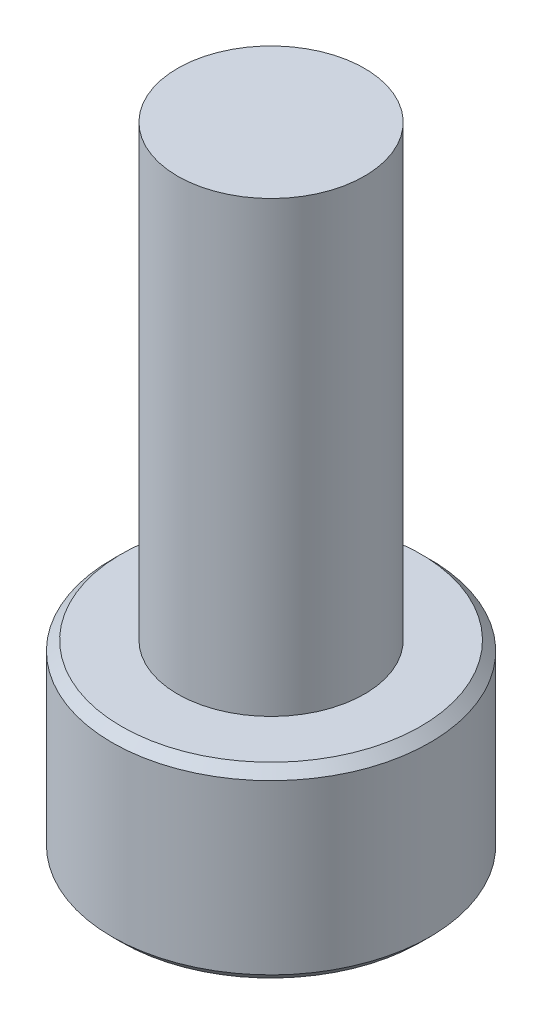
ISO-10303-21;
HEADER;
FILE_DESCRIPTION(('STEP AP214'),'2;1');
FILE_NAME('part.step','',(''),(''),'','','');
FILE_SCHEMA(('AUTOMOTIVE_DESIGN { 1 0 10303 214 1 1 1 1 }'));
ENDSEC;
DATA;
#1=APPLICATION_CONTEXT('core data for automotive mechanical design processes');
#2=APPLICATION_PROTOCOL_DEFINITION('international standard','automotive_design',2000,#1);
#3=PRODUCT_CONTEXT('',#1,'mechanical');
#4=PRODUCT('Part','Part','',(#3));
#5=PRODUCT_RELATED_PRODUCT_CATEGORY('part','',(#4));
#6=PRODUCT_DEFINITION_FORMATION('','',#4);
#7=PRODUCT_DEFINITION_CONTEXT('part definition',#1,'design');
#8=PRODUCT_DEFINITION('design','',#6,#7);
#9=PRODUCT_DEFINITION_SHAPE('','',#8);
#10=(LENGTH_UNIT() NAMED_UNIT(*) SI_UNIT(.MILLI.,.METRE.));
#11=(NAMED_UNIT(*) PLANE_ANGLE_UNIT() SI_UNIT($,.RADIAN.));
#12=(NAMED_UNIT(*) SI_UNIT($,.STERADIAN.) SOLID_ANGLE_UNIT());
#13=UNCERTAINTY_MEASURE_WITH_UNIT(LENGTH_MEASURE(1.E-05),#10,'distance_accuracy_value','');
#14=(GEOMETRIC_REPRESENTATION_CONTEXT(3) GLOBAL_UNCERTAINTY_ASSIGNED_CONTEXT((#13)) GLOBAL_UNIT_ASSIGNED_CONTEXT((#10,
#11,#12)) REPRESENTATION_CONTEXT('',''));
#15=CARTESIAN_POINT('',(0.,0.,0.));
#16=DIRECTION('',(0.,0.,1.));
#17=DIRECTION('',(1.,0.,0.));
#18=AXIS2_PLACEMENT_3D('',#15,#16,#17);
#19=CARTESIAN_POINT('',(0.,-5.,0.));
#20=DIRECTION('',(0.,1.,0.));
#21=DIRECTION('',(0.,0.,1.));
#22=AXIS2_PLACEMENT_3D('',#19,#20,#21);
#23=PLANE('',#22);
#24=CARTESIAN_POINT('',(0.,-5.,0.));
#25=DIRECTION('',(0.,1.,0.));
#26=DIRECTION('',(0.,0.,1.));
#27=AXIS2_PLACEMENT_3D('',#24,#25,#26);
#28=CIRCLE('',#27,4.);
#29=CARTESIAN_POINT('',(0.,-5.,4.));
#30=VERTEX_POINT('',#29);
#31=EDGE_CURVE('E11',#30,#30,#28,.F.);
#32=ORIENTED_EDGE('',*,*,#31,.T.);
#33=EDGE_LOOP('',(#32));
#34=FACE_BOUND('',#33,.T.);
#35=DIRECTION('',(0.866025403784439,0.,-0.5));
#36=VECTOR('',#35,1.);
#37=CARTESIAN_POINT('',(1.,-5.,1.73205080756888));
#38=LINE('',#37,#36);
#39=CARTESIAN_POINT('',(0.,-5.,2.3094010767585));
#40=VERTEX_POINT('',#39);
#41=CARTESIAN_POINT('',(2.,-5.,1.15470053837925));
#42=VERTEX_POINT('',#41);
#43=EDGE_CURVE('E55',#40,#42,#38,.T.);
#44=ORIENTED_EDGE('',*,*,#43,.T.);
#45=DIRECTION('',(0.,0.,-1.));
#46=VECTOR('',#45,1.);
#47=CARTESIAN_POINT('',(2.,-5.,0.));
#48=LINE('',#47,#46);
#49=CARTESIAN_POINT('',(2.,-5.,-1.15470053837925));
#50=VERTEX_POINT('',#49);
#51=EDGE_CURVE('E126',#42,#50,#48,.T.);
#52=ORIENTED_EDGE('',*,*,#51,.T.);
#53=DIRECTION('',(-0.866025403784439,0.,-0.5));
#54=VECTOR('',#53,1.);
#55=CARTESIAN_POINT('',(1.,-5.,-1.73205080756888));
#56=LINE('',#55,#54);
#57=CARTESIAN_POINT('',(0.,-5.,-2.3094010767585));
#58=VERTEX_POINT('',#57);
#59=EDGE_CURVE('E129',#50,#58,#56,.T.);
#60=ORIENTED_EDGE('',*,*,#59,.T.);
#61=DIRECTION('',(-0.866025403784439,0.,0.5));
#62=VECTOR('',#61,1.);
#63=CARTESIAN_POINT('',(-1.,-5.,-1.73205080756888));
#64=LINE('',#63,#62);
#65=CARTESIAN_POINT('',(-2.,-5.,-1.15470053837925));
#66=VERTEX_POINT('',#65);
#67=EDGE_CURVE('E132',#58,#66,#64,.T.);
#68=ORIENTED_EDGE('',*,*,#67,.T.);
#69=DIRECTION('',(0.,0.,1.));
#70=VECTOR('',#69,1.);
#71=CARTESIAN_POINT('',(-2.,-5.,0.));
#72=LINE('',#71,#70);
#73=CARTESIAN_POINT('',(-2.,-5.,1.15470053837925));
#74=VERTEX_POINT('',#73);
#75=EDGE_CURVE('E116',#66,#74,#72,.T.);
#76=ORIENTED_EDGE('',*,*,#75,.T.);
#77=DIRECTION('',(0.866025403784439,0.,0.5));
#78=VECTOR('',#77,1.);
#79=CARTESIAN_POINT('',(-1.,-5.,1.73205080756888));
#80=LINE('',#79,#78);
#81=EDGE_CURVE('E135',#74,#40,#80,.T.);
#82=ORIENTED_EDGE('',*,*,#81,.T.);
#83=EDGE_LOOP('',(#44,#52,#60,#68,#76,#82));
#84=FACE_BOUND('',#83,.T.);
#85=ADVANCED_FACE('F39',(#34,#84),#23,.F.);
#86=CARTESIAN_POINT('',(0.,-5.,0.));
#87=DIRECTION('',(0.,1.,0.));
#88=DIRECTION('',(0.,0.,1.));
#89=AXIS2_PLACEMENT_3D('',#86,#87,#88);
#90=CYLINDRICAL_SURFACE('',#89,4.25);
#91=CARTESIAN_POINT('',(0.,-0.249999999999997,0.));
#92=DIRECTION('',(0.,1.,0.));
#93=DIRECTION('',(0.,0.,1.));
#94=AXIS2_PLACEMENT_3D('',#91,#92,#93);
#95=CIRCLE('',#94,4.25);
#96=CARTESIAN_POINT('',(0.,-0.249999999999997,4.25));
#97=VERTEX_POINT('',#96);
#98=EDGE_CURVE('E48',#97,#97,#95,.F.);
#99=ORIENTED_EDGE('',*,*,#98,.T.);
#100=EDGE_LOOP('',(#99));
#101=FACE_BOUND('',#100,.T.);
#102=CARTESIAN_POINT('',(0.,-4.75,0.));
#103=DIRECTION('',(0.,1.,0.));
#104=DIRECTION('',(0.,0.,1.));
#105=AXIS2_PLACEMENT_3D('',#102,#103,#104);
#106=CIRCLE('',#105,4.25);
#107=CARTESIAN_POINT('',(0.,-4.75,4.25));
#108=VERTEX_POINT('',#107);
#109=EDGE_CURVE('E155',#108,#108,#106,.T.);
#110=ORIENTED_EDGE('',*,*,#109,.T.);
#111=EDGE_LOOP('',(#110));
#112=FACE_BOUND('',#111,.T.);
#113=ADVANCED_FACE('F160',(#101,#112),#90,.T.);
#114=CARTESIAN_POINT('',(0.,0.,0.));
#115=DIRECTION('',(0.,1.,0.));
#116=DIRECTION('',(0.,0.,1.));
#117=AXIS2_PLACEMENT_3D('',#114,#115,#116);
#118=PLANE('',#117);
#119=CARTESIAN_POINT('',(0.,0.,0.));
#120=DIRECTION('',(0.,1.,0.));
#121=DIRECTION('',(0.,0.,1.));
#122=AXIS2_PLACEMENT_3D('',#119,#120,#121);
#123=CIRCLE('',#122,4.);
#124=CARTESIAN_POINT('',(0.,0.,4.));
#125=VERTEX_POINT('',#124);
#126=EDGE_CURVE('E152',#125,#125,#123,.T.);
#127=ORIENTED_EDGE('',*,*,#126,.T.);
#128=EDGE_LOOP('',(#127));
#129=FACE_BOUND('',#128,.T.);
#130=CARTESIAN_POINT('',(0.,0.,0.));
#131=DIRECTION('',(0.,1.,0.));
#132=DIRECTION('',(0.,0.,1.));
#133=AXIS2_PLACEMENT_3D('',#130,#131,#132);
#134=CIRCLE('',#133,2.5);
#135=CARTESIAN_POINT('',(0.,0.,2.5));
#136=VERTEX_POINT('',#135);
#137=EDGE_CURVE('E149',#136,#136,#134,.T.);
#138=ORIENTED_EDGE('',*,*,#137,.F.);
#139=EDGE_LOOP('',(#138));
#140=FACE_BOUND('',#139,.T.);
#141=ADVANCED_FACE('F168',(#129,#140),#118,.T.);
#142=CARTESIAN_POINT('',(0.,12.,0.));
#143=DIRECTION('',(0.,-1.,0.));
#144=DIRECTION('',(0.,0.,-1.));
#145=AXIS2_PLACEMENT_3D('',#142,#143,#144);
#146=CYLINDRICAL_SURFACE('',#145,2.5);
#147=CARTESIAN_POINT('',(0.,12.,0.));
#148=DIRECTION('',(0.,1.,0.));
#149=DIRECTION('',(0.,0.,1.));
#150=AXIS2_PLACEMENT_3D('',#147,#148,#149);
#151=CIRCLE('',#150,2.5);
#152=CARTESIAN_POINT('',(0.,12.,2.5));
#153=VERTEX_POINT('',#152);
#154=EDGE_CURVE('E146',#153,#153,#151,.T.);
#155=ORIENTED_EDGE('',*,*,#154,.F.);
#156=EDGE_LOOP('',(#155));
#157=FACE_BOUND('',#156,.T.);
#158=ORIENTED_EDGE('',*,*,#137,.T.);
#159=EDGE_LOOP('',(#158));
#160=FACE_BOUND('',#159,.T.);
#161=ADVANCED_FACE('F171',(#157,#160),#146,.T.);
#162=CARTESIAN_POINT('',(0.,12.,0.));
#163=DIRECTION('',(0.,1.,0.));
#164=DIRECTION('',(0.,0.,1.));
#165=AXIS2_PLACEMENT_3D('',#162,#163,#164);
#166=PLANE('',#165);
#167=ORIENTED_EDGE('',*,*,#154,.T.);
#168=EDGE_LOOP('',(#167));
#169=FACE_BOUND('',#168,.T.);
#170=ADVANCED_FACE('F176',(#169),#166,.T.);
#171=CARTESIAN_POINT('',(1.,-2.5,1.73205080756888));
#172=DIRECTION('',(-0.5,0.,-0.866025403784439));
#173=DIRECTION('',(-0.866025403784439,0.,0.5));
#174=AXIS2_PLACEMENT_3D('',#171,#172,#173);
#175=PLANE('',#174);
#176=ORIENTED_EDGE('',*,*,#43,.F.);
#177=DIRECTION('',(0.,-1.,0.));
#178=VECTOR('',#177,1.);
#179=CARTESIAN_POINT('',(0.,-2.5,2.3094010767585));
#180=LINE('',#179,#178);
#181=CARTESIAN_POINT('',(0.,-2.5,2.3094010767585));
#182=VERTEX_POINT('',#181);
#183=EDGE_CURVE('E121',#182,#40,#180,.T.);
#184=ORIENTED_EDGE('',*,*,#183,.F.);
#185=DIRECTION('',(0.866025403784439,0.,-0.5));
#186=VECTOR('',#185,1.);
#187=CARTESIAN_POINT('',(1.,-2.5,1.73205080756888));
#188=LINE('',#187,#186);
#189=CARTESIAN_POINT('',(2.,-2.5,1.15470053837925));
#190=VERTEX_POINT('',#189);
#191=EDGE_CURVE('E138',#182,#190,#188,.T.);
#192=ORIENTED_EDGE('',*,*,#191,.T.);
#193=DIRECTION('',(0.,-1.,0.));
#194=VECTOR('',#193,1.);
#195=CARTESIAN_POINT('',(2.,-2.5,1.15470053837925));
#196=LINE('',#195,#194);
#197=EDGE_CURVE('E144',#190,#42,#196,.T.);
#198=ORIENTED_EDGE('',*,*,#197,.T.);
#199=EDGE_LOOP('',(#176,#184,#192,#198));
#200=FACE_BOUND('',#199,.T.);
#201=ADVANCED_FACE('F183',(#200),#175,.T.);
#202=CARTESIAN_POINT('',(2.,-2.5,0.));
#203=DIRECTION('',(-1.,0.,0.));
#204=DIRECTION('',(0.,0.,1.));
#205=AXIS2_PLACEMENT_3D('',#202,#203,#204);
#206=PLANE('',#205);
#207=ORIENTED_EDGE('',*,*,#51,.F.);
#208=ORIENTED_EDGE('',*,*,#197,.F.);
#209=DIRECTION('',(0.,0.,-1.));
#210=VECTOR('',#209,1.);
#211=CARTESIAN_POINT('',(2.,-2.5,0.));
#212=LINE('',#211,#210);
#213=CARTESIAN_POINT('',(2.,-2.5,-1.15470053837925));
#214=VERTEX_POINT('',#213);
#215=EDGE_CURVE('E94',#190,#214,#212,.T.);
#216=ORIENTED_EDGE('',*,*,#215,.T.);
#217=DIRECTION('',(0.,-1.,0.));
#218=VECTOR('',#217,1.);
#219=CARTESIAN_POINT('',(2.,-2.5,-1.15470053837925));
#220=LINE('',#219,#218);
#221=EDGE_CURVE('E142',#214,#50,#220,.T.);
#222=ORIENTED_EDGE('',*,*,#221,.T.);
#223=EDGE_LOOP('',(#207,#208,#216,#222));
#224=FACE_BOUND('',#223,.T.);
#225=ADVANCED_FACE('F211',(#224),#206,.T.);
#226=CARTESIAN_POINT('',(1.,-2.5,-1.73205080756888));
#227=DIRECTION('',(-0.5,0.,0.866025403784439));
#228=DIRECTION('',(0.866025403784439,0.,0.5));
#229=AXIS2_PLACEMENT_3D('',#226,#227,#228);
#230=PLANE('',#229);
#231=ORIENTED_EDGE('',*,*,#59,.F.);
#232=ORIENTED_EDGE('',*,*,#221,.F.);
#233=DIRECTION('',(-0.866025403784439,0.,-0.5));
#234=VECTOR('',#233,1.);
#235=CARTESIAN_POINT('',(1.,-2.5,-1.73205080756888));
#236=LINE('',#235,#234);
#237=CARTESIAN_POINT('',(0.,-2.5,-2.3094010767585));
#238=VERTEX_POINT('',#237);
#239=EDGE_CURVE('E112',#214,#238,#236,.T.);
#240=ORIENTED_EDGE('',*,*,#239,.T.);
#241=DIRECTION('',(0.,-1.,0.));
#242=VECTOR('',#241,1.);
#243=CARTESIAN_POINT('',(0.,-2.5,-2.3094010767585));
#244=LINE('',#243,#242);
#245=EDGE_CURVE('E109',#238,#58,#244,.T.);
#246=ORIENTED_EDGE('',*,*,#245,.T.);
#247=EDGE_LOOP('',(#231,#232,#240,#246));
#248=FACE_BOUND('',#247,.T.);
#249=ADVANCED_FACE('F209',(#248),#230,.T.);
#250=CARTESIAN_POINT('',(-1.,-2.5,-1.73205080756888));
#251=DIRECTION('',(0.5,0.,0.866025403784439));
#252=DIRECTION('',(0.866025403784439,0.,-0.5));
#253=AXIS2_PLACEMENT_3D('',#250,#251,#252);
#254=PLANE('',#253);
#255=ORIENTED_EDGE('',*,*,#67,.F.);
#256=ORIENTED_EDGE('',*,*,#245,.F.);
#257=DIRECTION('',(-0.866025403784439,0.,0.5));
#258=VECTOR('',#257,1.);
#259=CARTESIAN_POINT('',(-1.,-2.5,-1.73205080756888));
#260=LINE('',#259,#258);
#261=CARTESIAN_POINT('',(-2.,-2.5,-1.15470053837925));
#262=VERTEX_POINT('',#261);
#263=EDGE_CURVE('E104',#238,#262,#260,.T.);
#264=ORIENTED_EDGE('',*,*,#263,.T.);
#265=DIRECTION('',(0.,-1.,0.));
#266=VECTOR('',#265,1.);
#267=CARTESIAN_POINT('',(-2.,-2.5,-1.15470053837925));
#268=LINE('',#267,#266);
#269=EDGE_CURVE('E108',#262,#66,#268,.T.);
#270=ORIENTED_EDGE('',*,*,#269,.T.);
#271=EDGE_LOOP('',(#255,#256,#264,#270));
#272=FACE_BOUND('',#271,.T.);
#273=ADVANCED_FACE('F107',(#272),#254,.T.);
#274=CARTESIAN_POINT('',(-2.,-2.5,0.));
#275=DIRECTION('',(1.,0.,0.));
#276=DIRECTION('',(0.,0.,-1.));
#277=AXIS2_PLACEMENT_3D('',#274,#275,#276);
#278=PLANE('',#277);
#279=ORIENTED_EDGE('',*,*,#75,.F.);
#280=ORIENTED_EDGE('',*,*,#269,.F.);
#281=DIRECTION('',(0.,0.,1.));
#282=VECTOR('',#281,1.);
#283=CARTESIAN_POINT('',(-2.,-2.5,0.));
#284=LINE('',#283,#282);
#285=CARTESIAN_POINT('',(-2.,-2.5,1.15470053837925));
#286=VERTEX_POINT('',#285);
#287=EDGE_CURVE('E111',#262,#286,#284,.T.);
#288=ORIENTED_EDGE('',*,*,#287,.T.);
#289=DIRECTION('',(0.,-1.,0.));
#290=VECTOR('',#289,1.);
#291=CARTESIAN_POINT('',(-2.,-2.5,1.15470053837925));
#292=LINE('',#291,#290);
#293=EDGE_CURVE('E85',#286,#74,#292,.T.);
#294=ORIENTED_EDGE('',*,*,#293,.T.);
#295=EDGE_LOOP('',(#279,#280,#288,#294));
#296=FACE_BOUND('',#295,.T.);
#297=ADVANCED_FACE('F114',(#296),#278,.T.);
#298=CARTESIAN_POINT('',(-1.,-2.5,1.73205080756888));
#299=DIRECTION('',(0.5,0.,-0.866025403784438));
#300=DIRECTION('',(-0.866025403784438,0.,-0.5));
#301=AXIS2_PLACEMENT_3D('',#298,#299,#300);
#302=PLANE('',#301);
#303=ORIENTED_EDGE('',*,*,#81,.F.);
#304=ORIENTED_EDGE('',*,*,#293,.F.);
#305=DIRECTION('',(0.866025403784439,0.,0.5));
#306=VECTOR('',#305,1.);
#307=CARTESIAN_POINT('',(-1.,-2.5,1.73205080756888));
#308=LINE('',#307,#306);
#309=EDGE_CURVE('E63',#286,#182,#308,.T.);
#310=ORIENTED_EDGE('',*,*,#309,.T.);
#311=ORIENTED_EDGE('',*,*,#183,.T.);
#312=EDGE_LOOP('',(#303,#304,#310,#311));
#313=FACE_BOUND('',#312,.T.);
#314=ADVANCED_FACE('F202',(#313),#302,.T.);
#315=CARTESIAN_POINT('',(0.,-2.5,0.));
#316=DIRECTION('',(0.,1.,0.));
#317=DIRECTION('',(0.,0.,1.));
#318=AXIS2_PLACEMENT_3D('',#315,#316,#317);
#319=PLANE('',#318);
#320=ORIENTED_EDGE('',*,*,#191,.F.);
#321=ORIENTED_EDGE('',*,*,#309,.F.);
#322=ORIENTED_EDGE('',*,*,#287,.F.);
#323=ORIENTED_EDGE('',*,*,#263,.F.);
#324=ORIENTED_EDGE('',*,*,#239,.F.);
#325=ORIENTED_EDGE('',*,*,#215,.F.);
#326=EDGE_LOOP('',(#320,#321,#322,#323,#324,#325));
#327=FACE_BOUND('',#326,.T.);
#328=ADVANCED_FACE('F119',(#327),#319,.F.);
#329=CARTESIAN_POINT('',(0.,0.,0.));
#330=DIRECTION('',(0.,-1.,0.));
#331=DIRECTION('',(0.,0.,-1.));
#332=AXIS2_PLACEMENT_3D('',#329,#330,#331);
#333=CONICAL_SURFACE('',#332,4.,0.785398163397447);
#334=ORIENTED_EDGE('',*,*,#98,.F.);
#335=EDGE_LOOP('',(#334));
#336=FACE_BOUND('',#335,.T.);
#337=ORIENTED_EDGE('',*,*,#126,.F.);
#338=EDGE_LOOP('',(#337));
#339=FACE_BOUND('',#338,.T.);
#340=ADVANCED_FACE('F163',(#336,#339),#333,.T.);
#341=CARTESIAN_POINT('',(0.,-4.75,0.));
#342=DIRECTION('',(0.,1.,0.));
#343=DIRECTION('',(0.,0.,1.));
#344=AXIS2_PLACEMENT_3D('',#341,#342,#343);
#345=CONICAL_SURFACE('',#344,4.25,0.785398163397454);
#346=ORIENTED_EDGE('',*,*,#31,.F.);
#347=EDGE_LOOP('',(#346));
#348=FACE_BOUND('',#347,.T.);
#349=ORIENTED_EDGE('',*,*,#109,.F.);
#350=EDGE_LOOP('',(#349));
#351=FACE_BOUND('',#350,.T.);
#352=ADVANCED_FACE('F42',(#348,#351),#345,.T.);
#353=CLOSED_SHELL('',(#85,#113,#141,#161,#170,#201,#225,#249,#273,#297,#314,#328,#340,#352));
#354=MANIFOLD_SOLID_BREP('B2',#353);
#355=ADVANCED_BREP_SHAPE_REPRESENTATION('',(#18,#354),#14);
#356=SHAPE_DEFINITION_REPRESENTATION(#9,#355);
ENDSEC;
END-ISO-10303-21;
